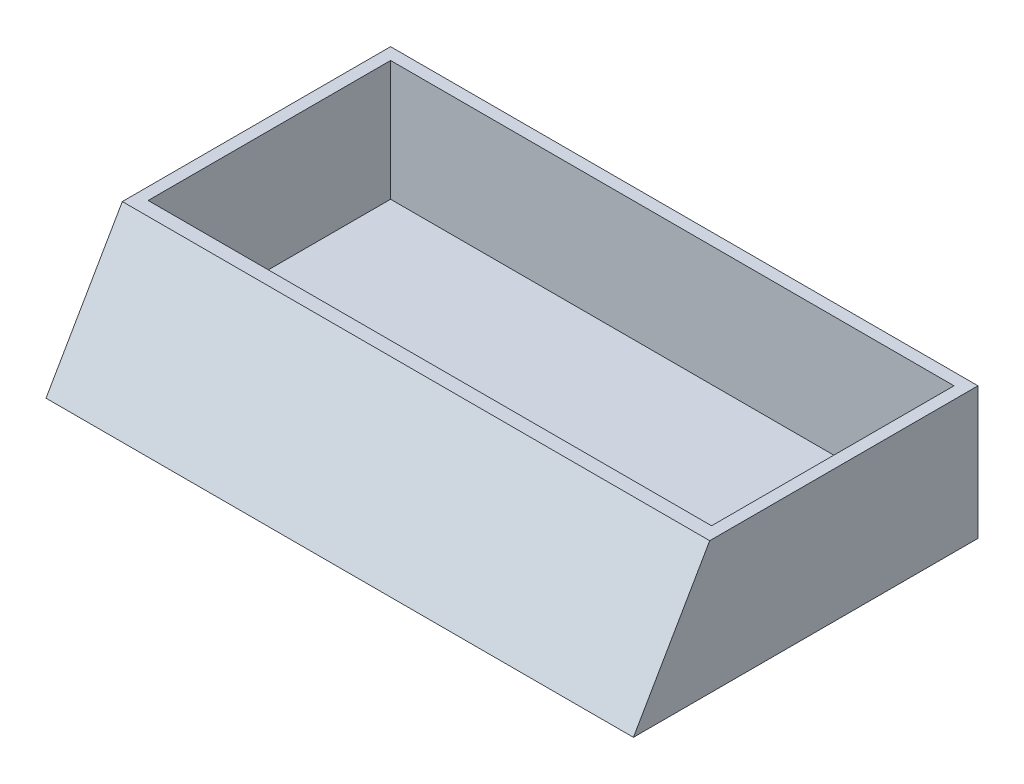
ISO-10303-21;
HEADER;
FILE_DESCRIPTION(('STEP AP214'),'2;1');
FILE_NAME('part.step','',(''),(''),'','','');
FILE_SCHEMA(('AUTOMOTIVE_DESIGN { 1 0 10303 214 1 1 1 1 }'));
ENDSEC;
DATA;
#1=APPLICATION_CONTEXT('core data for automotive mechanical design processes');
#2=APPLICATION_PROTOCOL_DEFINITION('international standard','automotive_design',2000,#1);
#3=PRODUCT_CONTEXT('',#1,'mechanical');
#4=PRODUCT('Part','Part','',(#3));
#5=PRODUCT_RELATED_PRODUCT_CATEGORY('part','',(#4));
#6=PRODUCT_DEFINITION_FORMATION('','',#4);
#7=PRODUCT_DEFINITION_CONTEXT('part definition',#1,'design');
#8=PRODUCT_DEFINITION('design','',#6,#7);
#9=PRODUCT_DEFINITION_SHAPE('','',#8);
#10=(LENGTH_UNIT() NAMED_UNIT(*) SI_UNIT(.MILLI.,.METRE.));
#11=(NAMED_UNIT(*) PLANE_ANGLE_UNIT() SI_UNIT($,.RADIAN.));
#12=(NAMED_UNIT(*) SI_UNIT($,.STERADIAN.) SOLID_ANGLE_UNIT());
#13=UNCERTAINTY_MEASURE_WITH_UNIT(LENGTH_MEASURE(1.E-05),#10,'distance_accuracy_value','');
#14=(GEOMETRIC_REPRESENTATION_CONTEXT(3) GLOBAL_UNCERTAINTY_ASSIGNED_CONTEXT((#13)) GLOBAL_UNIT_ASSIGNED_CONTEXT((#10,
#11,#12)) REPRESENTATION_CONTEXT('',''));
#15=CARTESIAN_POINT('',(0.,0.,0.));
#16=DIRECTION('',(0.,0.,1.));
#17=DIRECTION('',(1.,0.,0.));
#18=AXIS2_PLACEMENT_3D('',#15,#16,#17);
#19=CARTESIAN_POINT('',(196.,44.1,-114.98));
#20=DIRECTION('',(0.,-1.,0.));
#21=DIRECTION('',(0.,0.,-1.));
#22=AXIS2_PLACEMENT_3D('',#19,#20,#21);
#23=PLANE('',#22);
#24=DIRECTION('',(0.,0.,1.));
#25=VECTOR('',#24,1.);
#26=CARTESIAN_POINT('',(0.,44.1,-114.98));
#27=LINE('',#26,#25);
#28=CARTESIAN_POINT('',(0.,44.1,-114.98));
#29=VERTEX_POINT('',#28);
#30=CARTESIAN_POINT('',(0.,44.1,-25.4611468712623));
#31=VERTEX_POINT('',#30);
#32=EDGE_CURVE('E84',#29,#31,#27,.T.);
#33=ORIENTED_EDGE('',*,*,#32,.T.);
#34=DIRECTION('',(-1.,0.,0.));
#35=VECTOR('',#34,1.);
#36=CARTESIAN_POINT('',(196.,44.1,-25.4611468712623));
#37=LINE('',#36,#35);
#38=CARTESIAN_POINT('',(196.,44.1,-25.4611468712623));
#39=VERTEX_POINT('',#38);
#40=EDGE_CURVE('E156',#39,#31,#37,.T.);
#41=ORIENTED_EDGE('',*,*,#40,.F.);
#42=DIRECTION('',(0.,0.,1.));
#43=VECTOR('',#42,1.);
#44=CARTESIAN_POINT('',(196.,44.1,-114.98));
#45=LINE('',#44,#43);
#46=CARTESIAN_POINT('',(196.,44.1,-114.98));
#47=VERTEX_POINT('',#46);
#48=EDGE_CURVE('E63',#47,#39,#45,.T.);
#49=ORIENTED_EDGE('',*,*,#48,.F.);
#50=DIRECTION('',(-1.,0.,0.));
#51=VECTOR('',#50,1.);
#52=CARTESIAN_POINT('',(196.,44.1,-114.98));
#53=LINE('',#52,#51);
#54=EDGE_CURVE('E166',#47,#29,#53,.T.);
#55=ORIENTED_EDGE('',*,*,#54,.T.);
#56=EDGE_LOOP('',(#33,#41,#49,#55));
#57=FACE_BOUND('',#56,.T.);
#58=DIRECTION('',(0.,0.,1.));
#59=VECTOR('',#58,1.);
#60=CARTESIAN_POINT('',(4.,44.1,-114.98));
#61=LINE('',#60,#59);
#62=CARTESIAN_POINT('',(4.,44.1,-110.98));
#63=VERTEX_POINT('',#62);
#64=CARTESIAN_POINT('',(4.,44.1,-30.0799490247793));
#65=VERTEX_POINT('',#64);
#66=EDGE_CURVE('E137',#63,#65,#61,.T.);
#67=ORIENTED_EDGE('',*,*,#66,.F.);
#68=DIRECTION('',(-1.,0.,0.));
#69=VECTOR('',#68,1.);
#70=CARTESIAN_POINT('',(196.,44.1,-110.98));
#71=LINE('',#70,#69);
#72=CARTESIAN_POINT('',(192.,44.1,-110.98));
#73=VERTEX_POINT('',#72);
#74=EDGE_CURVE('E132',#73,#63,#71,.T.);
#75=ORIENTED_EDGE('',*,*,#74,.F.);
#76=DIRECTION('',(0.,0.,1.));
#77=VECTOR('',#76,1.);
#78=CARTESIAN_POINT('',(192.,44.1,-114.98));
#79=LINE('',#78,#77);
#80=CARTESIAN_POINT('',(192.,44.1,-30.0799490247793));
#81=VERTEX_POINT('',#80);
#82=EDGE_CURVE('E54',#73,#81,#79,.T.);
#83=ORIENTED_EDGE('',*,*,#82,.T.);
#84=DIRECTION('',(-1.,0.,0.));
#85=VECTOR('',#84,1.);
#86=CARTESIAN_POINT('',(196.,44.1,-30.0799490247793));
#87=LINE('',#86,#85);
#88=EDGE_CURVE('E145',#81,#65,#87,.T.);
#89=ORIENTED_EDGE('',*,*,#88,.T.);
#90=EDGE_LOOP('',(#67,#75,#83,#89));
#91=FACE_BOUND('',#90,.T.);
#92=ADVANCED_FACE('F39',(#57,#91),#23,.F.);
#93=CARTESIAN_POINT('',(196.,0.,0.));
#94=DIRECTION('',(0.,-0.499999999999998,-0.86602540378444));
#95=DIRECTION('',(0.,0.86602540378444,-0.499999999999998));
#96=AXIS2_PLACEMENT_3D('',#93,#94,#95);
#97=PLANE('',#96);
#98=DIRECTION('',(0.,-0.86602540378444,0.499999999999998));
#99=VECTOR('',#98,1.);
#100=CARTESIAN_POINT('',(0.,0.,0.));
#101=LINE('',#100,#99);
#102=CARTESIAN_POINT('',(0.,0.,0.));
#103=VERTEX_POINT('',#102);
#104=EDGE_CURVE('E157',#31,#103,#101,.T.);
#105=ORIENTED_EDGE('',*,*,#104,.T.);
#106=DIRECTION('',(-1.,0.,0.));
#107=VECTOR('',#106,1.);
#108=CARTESIAN_POINT('',(196.,0.,0.));
#109=LINE('',#108,#107);
#110=CARTESIAN_POINT('',(196.,0.,0.));
#111=VERTEX_POINT('',#110);
#112=EDGE_CURVE('E11',#111,#103,#109,.T.);
#113=ORIENTED_EDGE('',*,*,#112,.F.);
#114=DIRECTION('',(0.,-0.86602540378444,0.499999999999998));
#115=VECTOR('',#114,1.);
#116=CARTESIAN_POINT('',(196.,0.,0.));
#117=LINE('',#116,#115);
#118=EDGE_CURVE('E150',#39,#111,#117,.T.);
#119=ORIENTED_EDGE('',*,*,#118,.F.);
#120=ORIENTED_EDGE('',*,*,#40,.T.);
#121=EDGE_LOOP('',(#105,#113,#119,#120));
#122=FACE_BOUND('',#121,.T.);
#123=ADVANCED_FACE('F41',(#122),#97,.F.);
#124=CARTESIAN_POINT('',(196.,0.,0.));
#125=DIRECTION('',(0.,1.,0.));
#126=DIRECTION('',(0.,0.,1.));
#127=AXIS2_PLACEMENT_3D('',#124,#125,#126);
#128=PLANE('',#127);
#129=DIRECTION('',(0.,0.,-1.));
#130=VECTOR('',#129,1.);
#131=CARTESIAN_POINT('',(0.,0.,0.));
#132=LINE('',#131,#130);
#133=CARTESIAN_POINT('',(0.,0.,-114.98));
#134=VERTEX_POINT('',#133);
#135=EDGE_CURVE('E160',#103,#134,#132,.T.);
#136=ORIENTED_EDGE('',*,*,#135,.T.);
#137=DIRECTION('',(-1.,0.,0.));
#138=VECTOR('',#137,1.);
#139=CARTESIAN_POINT('',(196.,0.,-114.98));
#140=LINE('',#139,#138);
#141=CARTESIAN_POINT('',(196.,0.,-114.98));
#142=VERTEX_POINT('',#141);
#143=EDGE_CURVE('E47',#142,#134,#140,.T.);
#144=ORIENTED_EDGE('',*,*,#143,.F.);
#145=DIRECTION('',(0.,0.,-1.));
#146=VECTOR('',#145,1.);
#147=CARTESIAN_POINT('',(196.,0.,0.));
#148=LINE('',#147,#146);
#149=EDGE_CURVE('E91',#111,#142,#148,.T.);
#150=ORIENTED_EDGE('',*,*,#149,.F.);
#151=ORIENTED_EDGE('',*,*,#112,.T.);
#152=EDGE_LOOP('',(#136,#144,#150,#151));
#153=FACE_BOUND('',#152,.T.);
#154=ADVANCED_FACE('F205',(#153),#128,.F.);
#155=CARTESIAN_POINT('',(196.,0.,-114.98));
#156=DIRECTION('',(0.,0.,1.));
#157=DIRECTION('',(1.,0.,0.));
#158=AXIS2_PLACEMENT_3D('',#155,#156,#157);
#159=PLANE('',#158);
#160=DIRECTION('',(0.,1.,0.));
#161=VECTOR('',#160,1.);
#162=CARTESIAN_POINT('',(0.,0.,-114.98));
#163=LINE('',#162,#161);
#164=EDGE_CURVE('E162',#134,#29,#163,.T.);
#165=ORIENTED_EDGE('',*,*,#164,.T.);
#166=ORIENTED_EDGE('',*,*,#54,.F.);
#167=DIRECTION('',(0.,1.,0.));
#168=VECTOR('',#167,1.);
#169=CARTESIAN_POINT('',(196.,0.,-114.98));
#170=LINE('',#169,#168);
#171=EDGE_CURVE('E153',#142,#47,#170,.T.);
#172=ORIENTED_EDGE('',*,*,#171,.F.);
#173=ORIENTED_EDGE('',*,*,#143,.T.);
#174=EDGE_LOOP('',(#165,#166,#172,#173));
#175=FACE_BOUND('',#174,.T.);
#176=ADVANCED_FACE('F171',(#175),#159,.F.);
#177=CARTESIAN_POINT('',(196.,0.,0.));
#178=DIRECTION('',(1.,0.,0.));
#179=DIRECTION('',(0.,0.,-1.));
#180=AXIS2_PLACEMENT_3D('',#177,#178,#179);
#181=PLANE('',#180);
#182=ORIENTED_EDGE('',*,*,#118,.T.);
#183=ORIENTED_EDGE('',*,*,#149,.T.);
#184=ORIENTED_EDGE('',*,*,#171,.T.);
#185=ORIENTED_EDGE('',*,*,#48,.T.);
#186=EDGE_LOOP('',(#182,#183,#184,#185));
#187=FACE_BOUND('',#186,.T.);
#188=ADVANCED_FACE('F199',(#187),#181,.T.);
#189=CARTESIAN_POINT('',(0.,0.,0.));
#190=DIRECTION('',(1.,0.,0.));
#191=DIRECTION('',(0.,0.,-1.));
#192=AXIS2_PLACEMENT_3D('',#189,#190,#191);
#193=PLANE('',#192);
#194=ORIENTED_EDGE('',*,*,#104,.F.);
#195=ORIENTED_EDGE('',*,*,#32,.F.);
#196=ORIENTED_EDGE('',*,*,#164,.F.);
#197=ORIENTED_EDGE('',*,*,#135,.F.);
#198=EDGE_LOOP('',(#194,#195,#196,#197));
#199=FACE_BOUND('',#198,.T.);
#200=ADVANCED_FACE('F175',(#199),#193,.F.);
#201=CARTESIAN_POINT('',(196.,-1.99999999999999,-3.46410161513776));
#202=DIRECTION('',(0.,-0.499999999999998,-0.86602540378444));
#203=DIRECTION('',(0.,0.86602540378444,-0.499999999999998));
#204=AXIS2_PLACEMENT_3D('',#201,#202,#203);
#205=PLANE('',#204);
#206=DIRECTION('',(0.,-0.86602540378444,0.499999999999998));
#207=VECTOR('',#206,1.);
#208=CARTESIAN_POINT('',(4.,-1.99999999999999,-3.46410161513776));
#209=LINE('',#208,#207);
#210=CARTESIAN_POINT('',(4.,4.,-6.92820323027549));
#211=VERTEX_POINT('',#210);
#212=EDGE_CURVE('E121',#65,#211,#209,.T.);
#213=ORIENTED_EDGE('',*,*,#212,.F.);
#214=ORIENTED_EDGE('',*,*,#88,.F.);
#215=DIRECTION('',(0.,-0.86602540378444,0.499999999999998));
#216=VECTOR('',#215,1.);
#217=CARTESIAN_POINT('',(192.,-1.99999999999999,-3.46410161513776));
#218=LINE('',#217,#216);
#219=CARTESIAN_POINT('',(192.,4.,-6.92820323027549));
#220=VERTEX_POINT('',#219);
#221=EDGE_CURVE('E139',#81,#220,#218,.T.);
#222=ORIENTED_EDGE('',*,*,#221,.T.);
#223=DIRECTION('',(-1.,0.,0.));
#224=VECTOR('',#223,1.);
#225=CARTESIAN_POINT('',(196.,4.,-6.92820323027549));
#226=LINE('',#225,#224);
#227=EDGE_CURVE('E131',#220,#211,#226,.T.);
#228=ORIENTED_EDGE('',*,*,#227,.T.);
#229=EDGE_LOOP('',(#213,#214,#222,#228));
#230=FACE_BOUND('',#229,.T.);
#231=ADVANCED_FACE('F183',(#230),#205,.T.);
#232=CARTESIAN_POINT('',(196.,4.,0.));
#233=DIRECTION('',(0.,1.,0.));
#234=DIRECTION('',(0.,0.,1.));
#235=AXIS2_PLACEMENT_3D('',#232,#233,#234);
#236=PLANE('',#235);
#237=DIRECTION('',(0.,0.,-1.));
#238=VECTOR('',#237,1.);
#239=CARTESIAN_POINT('',(4.,4.,0.));
#240=LINE('',#239,#238);
#241=CARTESIAN_POINT('',(4.,4.,-110.98));
#242=VERTEX_POINT('',#241);
#243=EDGE_CURVE('E114',#211,#242,#240,.T.);
#244=ORIENTED_EDGE('',*,*,#243,.F.);
#245=ORIENTED_EDGE('',*,*,#227,.F.);
#246=DIRECTION('',(0.,0.,-1.));
#247=VECTOR('',#246,1.);
#248=CARTESIAN_POINT('',(192.,4.,0.));
#249=LINE('',#248,#247);
#250=CARTESIAN_POINT('',(192.,4.,-110.98));
#251=VERTEX_POINT('',#250);
#252=EDGE_CURVE('E129',#220,#251,#249,.T.);
#253=ORIENTED_EDGE('',*,*,#252,.T.);
#254=DIRECTION('',(-1.,0.,0.));
#255=VECTOR('',#254,1.);
#256=CARTESIAN_POINT('',(196.,4.,-110.98));
#257=LINE('',#256,#255);
#258=EDGE_CURVE('E127',#251,#242,#257,.T.);
#259=ORIENTED_EDGE('',*,*,#258,.T.);
#260=EDGE_LOOP('',(#244,#245,#253,#259));
#261=FACE_BOUND('',#260,.T.);
#262=ADVANCED_FACE('F128',(#261),#236,.T.);
#263=CARTESIAN_POINT('',(196.,0.,-110.98));
#264=DIRECTION('',(0.,0.,1.));
#265=DIRECTION('',(1.,0.,0.));
#266=AXIS2_PLACEMENT_3D('',#263,#264,#265);
#267=PLANE('',#266);
#268=DIRECTION('',(0.,1.,0.));
#269=VECTOR('',#268,1.);
#270=CARTESIAN_POINT('',(4.,0.,-110.98));
#271=LINE('',#270,#269);
#272=EDGE_CURVE('E118',#242,#63,#271,.T.);
#273=ORIENTED_EDGE('',*,*,#272,.F.);
#274=ORIENTED_EDGE('',*,*,#258,.F.);
#275=DIRECTION('',(0.,1.,0.));
#276=VECTOR('',#275,1.);
#277=CARTESIAN_POINT('',(192.,0.,-110.98));
#278=LINE('',#277,#276);
#279=EDGE_CURVE('E143',#251,#73,#278,.T.);
#280=ORIENTED_EDGE('',*,*,#279,.T.);
#281=ORIENTED_EDGE('',*,*,#74,.T.);
#282=EDGE_LOOP('',(#273,#274,#280,#281));
#283=FACE_BOUND('',#282,.T.);
#284=ADVANCED_FACE('F134',(#283),#267,.T.);
#285=CARTESIAN_POINT('',(192.,0.,0.));
#286=DIRECTION('',(1.,0.,0.));
#287=DIRECTION('',(0.,0.,-1.));
#288=AXIS2_PLACEMENT_3D('',#285,#286,#287);
#289=PLANE('',#288);
#290=ORIENTED_EDGE('',*,*,#221,.F.);
#291=ORIENTED_EDGE('',*,*,#82,.F.);
#292=ORIENTED_EDGE('',*,*,#279,.F.);
#293=ORIENTED_EDGE('',*,*,#252,.F.);
#294=EDGE_LOOP('',(#290,#291,#292,#293));
#295=FACE_BOUND('',#294,.T.);
#296=ADVANCED_FACE('F188',(#295),#289,.F.);
#297=CARTESIAN_POINT('',(4.,0.,0.));
#298=DIRECTION('',(1.,0.,0.));
#299=DIRECTION('',(0.,0.,-1.));
#300=AXIS2_PLACEMENT_3D('',#297,#298,#299);
#301=PLANE('',#300);
#302=ORIENTED_EDGE('',*,*,#212,.T.);
#303=ORIENTED_EDGE('',*,*,#243,.T.);
#304=ORIENTED_EDGE('',*,*,#272,.T.);
#305=ORIENTED_EDGE('',*,*,#66,.T.);
#306=EDGE_LOOP('',(#302,#303,#304,#305));
#307=FACE_BOUND('',#306,.T.);
#308=ADVANCED_FACE('F116',(#307),#301,.T.);
#309=CLOSED_SHELL('',(#92,#123,#154,#176,#188,#200,#231,#262,#284,#296,#308));
#310=MANIFOLD_SOLID_BREP('B2',#309);
#311=ADVANCED_BREP_SHAPE_REPRESENTATION('',(#18,#310),#14);
#312=SHAPE_DEFINITION_REPRESENTATION(#9,#311);
ENDSEC;
END-ISO-10303-21;
